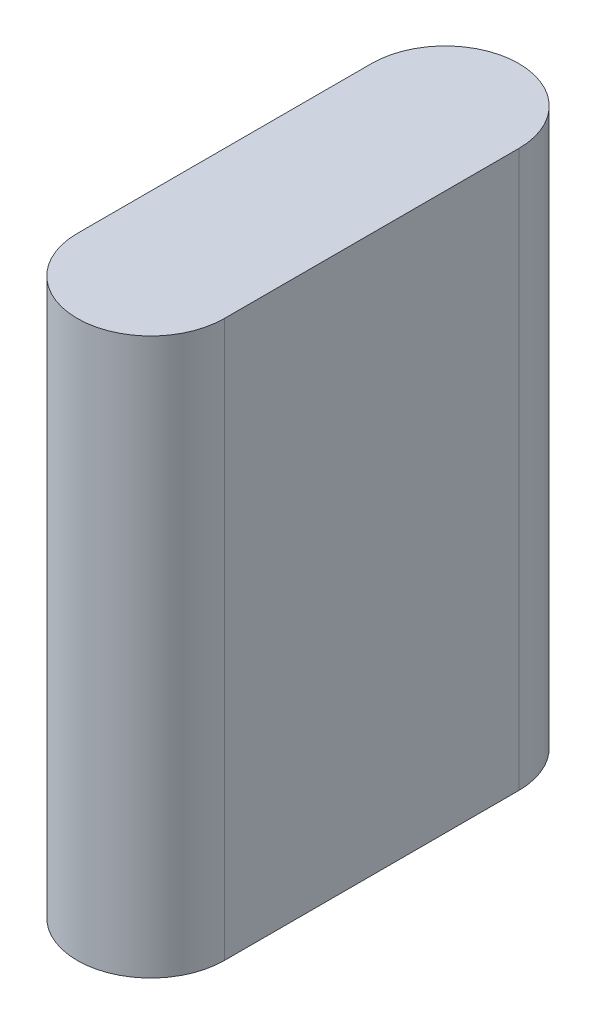
ISO-10303-21;
HEADER;
FILE_DESCRIPTION(('STEP AP214'),'2;1');
FILE_NAME('part.step','',(''),(''),'','','');
FILE_SCHEMA(('AUTOMOTIVE_DESIGN { 1 0 10303 214 1 1 1 1 }'));
ENDSEC;
DATA;
#1=APPLICATION_CONTEXT('core data for automotive mechanical design processes');
#2=APPLICATION_PROTOCOL_DEFINITION('international standard','automotive_design',2000,#1);
#3=PRODUCT_CONTEXT('',#1,'mechanical');
#4=PRODUCT('Part','Part','',(#3));
#5=PRODUCT_RELATED_PRODUCT_CATEGORY('part','',(#4));
#6=PRODUCT_DEFINITION_FORMATION('','',#4);
#7=PRODUCT_DEFINITION_CONTEXT('part definition',#1,'design');
#8=PRODUCT_DEFINITION('design','',#6,#7);
#9=PRODUCT_DEFINITION_SHAPE('','',#8);
#10=(LENGTH_UNIT() NAMED_UNIT(*) SI_UNIT(.MILLI.,.METRE.));
#11=(NAMED_UNIT(*) PLANE_ANGLE_UNIT() SI_UNIT($,.RADIAN.));
#12=(NAMED_UNIT(*) SI_UNIT($,.STERADIAN.) SOLID_ANGLE_UNIT());
#13=UNCERTAINTY_MEASURE_WITH_UNIT(LENGTH_MEASURE(1.E-05),#10,'distance_accuracy_value','');
#14=(GEOMETRIC_REPRESENTATION_CONTEXT(3) GLOBAL_UNCERTAINTY_ASSIGNED_CONTEXT((#13)) GLOBAL_UNIT_ASSIGNED_CONTEXT((#10,
#11,#12)) REPRESENTATION_CONTEXT('',''));
#15=CARTESIAN_POINT('',(0.,0.,0.));
#16=DIRECTION('',(0.,0.,1.));
#17=DIRECTION('',(1.,0.,0.));
#18=AXIS2_PLACEMENT_3D('',#15,#16,#17);
#19=CARTESIAN_POINT('',(9.00000000000002,68.,0.));
#20=DIRECTION('',(-1.,0.,0.));
#21=DIRECTION('',(0.,0.,1.));
#22=AXIS2_PLACEMENT_3D('',#19,#20,#21);
#23=PLANE('',#22);
#24=DIRECTION('',(0.,-1.,0.));
#25=VECTOR('',#24,1.);
#26=CARTESIAN_POINT('',(9.00000000000002,68.,0.));
#27=LINE('',#26,#25);
#28=CARTESIAN_POINT('',(9.00000000000001,68.,0.));
#29=VERTEX_POINT('',#28);
#30=CARTESIAN_POINT('',(9.00000000000001,0.,0.));
#31=VERTEX_POINT('',#30);
#32=EDGE_CURVE('E65',#29,#31,#27,.T.);
#33=ORIENTED_EDGE('',*,*,#32,.F.);
#34=DIRECTION('',(0.,0.,1.));
#35=VECTOR('',#34,1.);
#36=CARTESIAN_POINT('',(8.99999999999999,68.,0.));
#37=LINE('',#36,#35);
#38=CARTESIAN_POINT('',(8.99999999999999,68.,36.));
#39=VERTEX_POINT('',#38);
#40=EDGE_CURVE('E60',#39,#29,#37,.F.);
#41=ORIENTED_EDGE('',*,*,#40,.F.);
#42=DIRECTION('',(0.,-1.,0.));
#43=VECTOR('',#42,1.);
#44=CARTESIAN_POINT('',(8.99999999999999,68.,36.));
#45=LINE('',#44,#43);
#46=CARTESIAN_POINT('',(8.99999999999999,0.,36.));
#47=VERTEX_POINT('',#46);
#48=EDGE_CURVE('E82',#47,#39,#45,.F.);
#49=ORIENTED_EDGE('',*,*,#48,.F.);
#50=DIRECTION('',(0.,0.,1.));
#51=VECTOR('',#50,1.);
#52=CARTESIAN_POINT('',(8.99999999999999,0.,0.));
#53=LINE('',#52,#51);
#54=EDGE_CURVE('E77',#47,#31,#53,.F.);
#55=ORIENTED_EDGE('',*,*,#54,.T.);
#56=EDGE_LOOP('',(#33,#41,#49,#55));
#57=FACE_BOUND('',#56,.T.);
#58=ADVANCED_FACE('F17',(#57),#23,.F.);
#59=CARTESIAN_POINT('',(0.,68.,0.));
#60=DIRECTION('',(0.,-1.,0.));
#61=DIRECTION('',(0.,0.,-1.));
#62=AXIS2_PLACEMENT_3D('',#59,#60,#61);
#63=CYLINDRICAL_SURFACE('',#62,9.00000000000002);
#64=CARTESIAN_POINT('',(0.,0.,0.));
#65=DIRECTION('',(0.,-1.,0.));
#66=DIRECTION('',(0.,0.,-1.));
#67=AXIS2_PLACEMENT_3D('',#64,#65,#66);
#68=CIRCLE('',#67,9.00000000000002);
#69=CARTESIAN_POINT('',(-9.00000000000002,0.,0.));
#70=VERTEX_POINT('',#69);
#71=EDGE_CURVE('E75',#31,#70,#68,.F.);
#72=ORIENTED_EDGE('',*,*,#71,.T.);
#73=DIRECTION('',(0.,1.,0.));
#74=VECTOR('',#73,1.);
#75=CARTESIAN_POINT('',(-9.00000000000002,68.,0.));
#76=LINE('',#75,#74);
#77=CARTESIAN_POINT('',(-9.00000000000002,68.,0.));
#78=VERTEX_POINT('',#77);
#79=EDGE_CURVE('E70',#70,#78,#76,.T.);
#80=ORIENTED_EDGE('',*,*,#79,.T.);
#81=CARTESIAN_POINT('',(0.,68.,0.));
#82=DIRECTION('',(0.,-1.,0.));
#83=DIRECTION('',(0.,0.,-1.));
#84=AXIS2_PLACEMENT_3D('',#81,#82,#83);
#85=CIRCLE('',#84,9.00000000000002);
#86=EDGE_CURVE('E20',#29,#78,#85,.F.);
#87=ORIENTED_EDGE('',*,*,#86,.F.);
#88=ORIENTED_EDGE('',*,*,#32,.T.);
#89=EDGE_LOOP('',(#72,#80,#87,#88));
#90=FACE_BOUND('',#89,.T.);
#91=ADVANCED_FACE('F73',(#90),#63,.T.);
#92=CARTESIAN_POINT('',(0.,68.,0.));
#93=DIRECTION('',(0.,1.,0.));
#94=DIRECTION('',(0.,0.,1.));
#95=AXIS2_PLACEMENT_3D('',#92,#93,#94);
#96=PLANE('',#95);
#97=CARTESIAN_POINT('',(0.,68.,36.));
#98=DIRECTION('',(0.,-1.,0.));
#99=DIRECTION('',(0.,0.,-1.));
#100=AXIS2_PLACEMENT_3D('',#97,#98,#99);
#101=CIRCLE('',#100,8.99999999999999);
#102=CARTESIAN_POINT('',(-8.99999999999999,68.,36.));
#103=VERTEX_POINT('',#102);
#104=EDGE_CURVE('E84',#39,#103,#101,.T.);
#105=ORIENTED_EDGE('',*,*,#104,.F.);
#106=ORIENTED_EDGE('',*,*,#40,.T.);
#107=ORIENTED_EDGE('',*,*,#86,.T.);
#108=DIRECTION('',(0.,0.,-1.));
#109=VECTOR('',#108,1.);
#110=CARTESIAN_POINT('',(-9.00000000000002,68.,0.));
#111=LINE('',#110,#109);
#112=EDGE_CURVE('E58',#78,#103,#111,.F.);
#113=ORIENTED_EDGE('',*,*,#112,.T.);
#114=EDGE_LOOP('',(#105,#106,#107,#113));
#115=FACE_BOUND('',#114,.T.);
#116=ADVANCED_FACE('F57',(#115),#96,.T.);
#117=CARTESIAN_POINT('',(0.,68.,36.));
#118=DIRECTION('',(0.,-1.,0.));
#119=DIRECTION('',(0.,0.,-1.));
#120=AXIS2_PLACEMENT_3D('',#117,#118,#119);
#121=CYLINDRICAL_SURFACE('',#120,8.99999999999999);
#122=ORIENTED_EDGE('',*,*,#104,.T.);
#123=DIRECTION('',(0.,1.,0.));
#124=VECTOR('',#123,1.);
#125=CARTESIAN_POINT('',(-8.99999999999999,68.,36.));
#126=LINE('',#125,#124);
#127=CARTESIAN_POINT('',(-8.99999999999999,0.,36.));
#128=VERTEX_POINT('',#127);
#129=EDGE_CURVE('E26',#103,#128,#126,.F.);
#130=ORIENTED_EDGE('',*,*,#129,.T.);
#131=CARTESIAN_POINT('',(0.,0.,36.));
#132=DIRECTION('',(0.,-1.,0.));
#133=DIRECTION('',(0.,0.,-1.));
#134=AXIS2_PLACEMENT_3D('',#131,#132,#133);
#135=CIRCLE('',#134,8.99999999999999);
#136=EDGE_CURVE('E34',#128,#47,#135,.F.);
#137=ORIENTED_EDGE('',*,*,#136,.T.);
#138=ORIENTED_EDGE('',*,*,#48,.T.);
#139=EDGE_LOOP('',(#122,#130,#137,#138));
#140=FACE_BOUND('',#139,.T.);
#141=ADVANCED_FACE('F87',(#140),#121,.T.);
#142=CARTESIAN_POINT('',(0.,0.,0.));
#143=DIRECTION('',(0.,1.,0.));
#144=DIRECTION('',(0.,0.,1.));
#145=AXIS2_PLACEMENT_3D('',#142,#143,#144);
#146=PLANE('',#145);
#147=ORIENTED_EDGE('',*,*,#54,.F.);
#148=ORIENTED_EDGE('',*,*,#136,.F.);
#149=DIRECTION('',(0.,0.,-1.));
#150=VECTOR('',#149,1.);
#151=CARTESIAN_POINT('',(-9.00000000000002,0.,0.));
#152=LINE('',#151,#150);
#153=EDGE_CURVE('E11',#128,#70,#152,.T.);
#154=ORIENTED_EDGE('',*,*,#153,.T.);
#155=ORIENTED_EDGE('',*,*,#71,.F.);
#156=EDGE_LOOP('',(#147,#148,#154,#155));
#157=FACE_BOUND('',#156,.T.);
#158=ADVANCED_FACE('F90',(#157),#146,.F.);
#159=CARTESIAN_POINT('',(-9.00000000000002,68.,0.));
#160=DIRECTION('',(1.,0.,0.));
#161=DIRECTION('',(0.,0.,-1.));
#162=AXIS2_PLACEMENT_3D('',#159,#160,#161);
#163=PLANE('',#162);
#164=ORIENTED_EDGE('',*,*,#129,.F.);
#165=ORIENTED_EDGE('',*,*,#112,.F.);
#166=ORIENTED_EDGE('',*,*,#79,.F.);
#167=ORIENTED_EDGE('',*,*,#153,.F.);
#168=EDGE_LOOP('',(#164,#165,#166,#167));
#169=FACE_BOUND('',#168,.T.);
#170=ADVANCED_FACE('F69',(#169),#163,.F.);
#171=CLOSED_SHELL('',(#58,#91,#116,#141,#158,#170));
#172=MANIFOLD_SOLID_BREP('B1',#171);
#173=ADVANCED_BREP_SHAPE_REPRESENTATION('',(#18,#172),#14);
#174=SHAPE_DEFINITION_REPRESENTATION(#9,#173);
ENDSEC;
END-ISO-10303-21;
